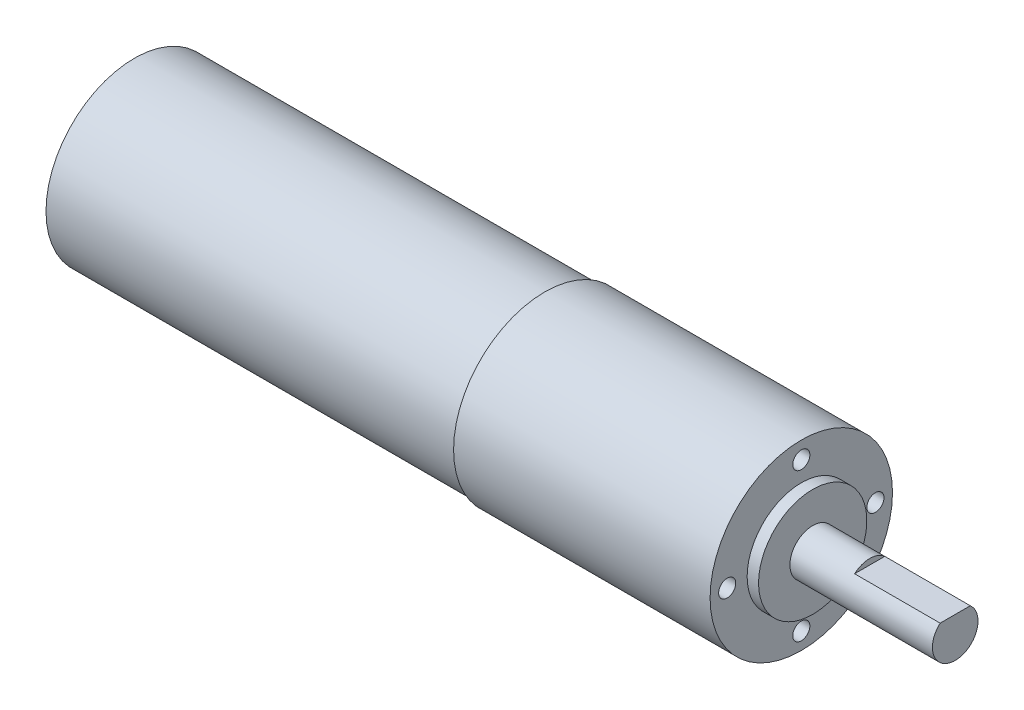
ISO-10303-21;
HEADER;
FILE_DESCRIPTION(('STEP AP214'),'2;1');
FILE_NAME('part.step','',(''),(''),'','','');
FILE_SCHEMA(('AUTOMOTIVE_DESIGN { 1 0 10303 214 1 1 1 1 }'));
ENDSEC;
DATA;
#1=APPLICATION_CONTEXT('core data for automotive mechanical design processes');
#2=APPLICATION_PROTOCOL_DEFINITION('international standard','automotive_design',2000,#1);
#3=PRODUCT_CONTEXT('',#1,'mechanical');
#4=PRODUCT('Part','Part','',(#3));
#5=PRODUCT_RELATED_PRODUCT_CATEGORY('part','',(#4));
#6=PRODUCT_DEFINITION_FORMATION('','',#4);
#7=PRODUCT_DEFINITION_CONTEXT('part definition',#1,'design');
#8=PRODUCT_DEFINITION('design','',#6,#7);
#9=PRODUCT_DEFINITION_SHAPE('','',#8);
#10=(LENGTH_UNIT() NAMED_UNIT(*) SI_UNIT(.MILLI.,.METRE.));
#11=(NAMED_UNIT(*) PLANE_ANGLE_UNIT() SI_UNIT($,.RADIAN.));
#12=(NAMED_UNIT(*) SI_UNIT($,.STERADIAN.) SOLID_ANGLE_UNIT());
#13=UNCERTAINTY_MEASURE_WITH_UNIT(LENGTH_MEASURE(1.E-05),#10,'distance_accuracy_value','');
#14=(GEOMETRIC_REPRESENTATION_CONTEXT(3) GLOBAL_UNCERTAINTY_ASSIGNED_CONTEXT((#13)) GLOBAL_UNIT_ASSIGNED_CONTEXT((#10,
#11,#12)) REPRESENTATION_CONTEXT('',''));
#15=CARTESIAN_POINT('',(0.,0.,0.));
#16=DIRECTION('',(0.,0.,1.));
#17=DIRECTION('',(1.,0.,0.));
#18=AXIS2_PLACEMENT_3D('',#15,#16,#17);
#19=CARTESIAN_POINT('',(0.,0.,0.));
#20=DIRECTION('',(1.,0.,0.));
#21=DIRECTION('',(0.,0.,-1.));
#22=AXIS2_PLACEMENT_3D('',#19,#20,#21);
#23=PLANE('',#22);
#24=CARTESIAN_POINT('',(0.,0.,0.));
#25=DIRECTION('',(-1.,0.,0.));
#26=DIRECTION('',(0.,0.,1.));
#27=AXIS2_PLACEMENT_3D('',#24,#25,#26);
#28=CIRCLE('',#27,15.5);
#29=CARTESIAN_POINT('',(0.,0.,15.5));
#30=VERTEX_POINT('',#29);
#31=EDGE_CURVE('E11',#30,#30,#28,.T.);
#32=ORIENTED_EDGE('',*,*,#31,.T.);
#33=EDGE_LOOP('',(#32));
#34=FACE_BOUND('',#33,.T.);
#35=ADVANCED_FACE('F39',(#34),#23,.F.);
#36=CARTESIAN_POINT('',(0.,0.,0.));
#37=DIRECTION('',(-1.,0.,0.));
#38=DIRECTION('',(0.,0.,1.));
#39=AXIS2_PLACEMENT_3D('',#36,#37,#38);
#40=CYLINDRICAL_SURFACE('',#39,15.5);
#41=ORIENTED_EDGE('',*,*,#31,.F.);
#42=EDGE_LOOP('',(#41));
#43=FACE_BOUND('',#42,.T.);
#44=CARTESIAN_POINT('',(72.,0.,0.));
#45=DIRECTION('',(-1.,0.,0.));
#46=DIRECTION('',(0.,0.,1.));
#47=AXIS2_PLACEMENT_3D('',#44,#45,#46);
#48=CIRCLE('',#47,15.5);
#49=CARTESIAN_POINT('',(72.,0.,15.5));
#50=VERTEX_POINT('',#49);
#51=EDGE_CURVE('E47',#50,#50,#48,.T.);
#52=ORIENTED_EDGE('',*,*,#51,.T.);
#53=EDGE_LOOP('',(#52));
#54=FACE_BOUND('',#53,.T.);
#55=ADVANCED_FACE('F109',(#43,#54),#40,.T.);
#56=CARTESIAN_POINT('',(72.,15.5,0.));
#57=DIRECTION('',(1.,0.,0.));
#58=DIRECTION('',(0.,0.,-1.));
#59=AXIS2_PLACEMENT_3D('',#56,#57,#58);
#60=PLANE('',#59);
#61=ORIENTED_EDGE('',*,*,#51,.F.);
#62=EDGE_LOOP('',(#61));
#63=FACE_BOUND('',#62,.T.);
#64=CARTESIAN_POINT('',(72.,0.,0.));
#65=DIRECTION('',(-1.,0.,0.));
#66=DIRECTION('',(0.,0.,1.));
#67=AXIS2_PLACEMENT_3D('',#64,#65,#66);
#68=CIRCLE('',#67,16.);
#69=CARTESIAN_POINT('',(72.,0.,16.));
#70=VERTEX_POINT('',#69);
#71=EDGE_CURVE('E102',#70,#70,#68,.T.);
#72=ORIENTED_EDGE('',*,*,#71,.T.);
#73=EDGE_LOOP('',(#72));
#74=FACE_BOUND('',#73,.T.);
#75=ADVANCED_FACE('F111',(#63,#74),#60,.F.);
#76=CARTESIAN_POINT('',(0.,0.,0.));
#77=DIRECTION('',(-1.,0.,0.));
#78=DIRECTION('',(0.,0.,1.));
#79=AXIS2_PLACEMENT_3D('',#76,#77,#78);
#80=CYLINDRICAL_SURFACE('',#79,16.);
#81=ORIENTED_EDGE('',*,*,#71,.F.);
#82=EDGE_LOOP('',(#81));
#83=FACE_BOUND('',#82,.T.);
#84=CARTESIAN_POINT('',(117.,0.,0.));
#85=DIRECTION('',(-1.,0.,0.));
#86=DIRECTION('',(0.,0.,1.));
#87=AXIS2_PLACEMENT_3D('',#84,#85,#86);
#88=CIRCLE('',#87,16.);
#89=CARTESIAN_POINT('',(117.,0.,16.));
#90=VERTEX_POINT('',#89);
#91=EDGE_CURVE('E98',#90,#90,#88,.T.);
#92=ORIENTED_EDGE('',*,*,#91,.T.);
#93=EDGE_LOOP('',(#92));
#94=FACE_BOUND('',#93,.T.);
#95=ADVANCED_FACE('F114',(#83,#94),#80,.T.);
#96=CARTESIAN_POINT('',(117.,16.,0.));
#97=DIRECTION('',(-1.,0.,0.));
#98=DIRECTION('',(0.,0.,1.));
#99=AXIS2_PLACEMENT_3D('',#96,#97,#98);
#100=PLANE('',#99);
#101=CARTESIAN_POINT('',(117.,13.,0.));
#102=DIRECTION('',(1.,0.,0.));
#103=DIRECTION('',(0.,0.,-1.));
#104=AXIS2_PLACEMENT_3D('',#101,#102,#103);
#105=CIRCLE('',#104,1.5);
#106=CARTESIAN_POINT('',(117.,13.,-1.5));
#107=VERTEX_POINT('',#106);
#108=EDGE_CURVE('E291',#107,#107,#105,.T.);
#109=ORIENTED_EDGE('',*,*,#108,.F.);
#110=EDGE_LOOP('',(#109));
#111=FACE_BOUND('',#110,.T.);
#112=CARTESIAN_POINT('',(117.,0.,-13.));
#113=DIRECTION('',(1.,0.,0.));
#114=DIRECTION('',(0.,0.,-1.));
#115=AXIS2_PLACEMENT_3D('',#112,#113,#114);
#116=CIRCLE('',#115,1.5);
#117=CARTESIAN_POINT('',(117.,0.,-14.5));
#118=VERTEX_POINT('',#117);
#119=EDGE_CURVE('E301',#118,#118,#116,.T.);
#120=ORIENTED_EDGE('',*,*,#119,.F.);
#121=EDGE_LOOP('',(#120));
#122=FACE_BOUND('',#121,.T.);
#123=CARTESIAN_POINT('',(117.,-13.,0.));
#124=DIRECTION('',(1.,0.,0.));
#125=DIRECTION('',(0.,0.,-1.));
#126=AXIS2_PLACEMENT_3D('',#123,#124,#125);
#127=CIRCLE('',#126,1.5);
#128=CARTESIAN_POINT('',(117.,-13.,-1.5));
#129=VERTEX_POINT('',#128);
#130=EDGE_CURVE('E309',#129,#129,#127,.T.);
#131=ORIENTED_EDGE('',*,*,#130,.F.);
#132=EDGE_LOOP('',(#131));
#133=FACE_BOUND('',#132,.T.);
#134=CARTESIAN_POINT('',(117.,0.,13.));
#135=DIRECTION('',(1.,0.,0.));
#136=DIRECTION('',(0.,0.,-1.));
#137=AXIS2_PLACEMENT_3D('',#134,#135,#136);
#138=CIRCLE('',#137,1.5);
#139=CARTESIAN_POINT('',(117.,0.,11.5));
#140=VERTEX_POINT('',#139);
#141=EDGE_CURVE('E317',#140,#140,#138,.T.);
#142=ORIENTED_EDGE('',*,*,#141,.F.);
#143=EDGE_LOOP('',(#142));
#144=FACE_BOUND('',#143,.T.);
#145=ORIENTED_EDGE('',*,*,#91,.F.);
#146=EDGE_LOOP('',(#145));
#147=FACE_BOUND('',#146,.T.);
#148=CARTESIAN_POINT('',(117.,0.,0.));
#149=DIRECTION('',(-1.,0.,0.));
#150=DIRECTION('',(0.,0.,1.));
#151=AXIS2_PLACEMENT_3D('',#148,#149,#150);
#152=CIRCLE('',#151,9.5);
#153=CARTESIAN_POINT('',(117.,0.,9.5));
#154=VERTEX_POINT('',#153);
#155=EDGE_CURVE('E94',#154,#154,#152,.T.);
#156=ORIENTED_EDGE('',*,*,#155,.T.);
#157=EDGE_LOOP('',(#156));
#158=FACE_BOUND('',#157,.T.);
#159=ADVANCED_FACE('F120',(#111,#122,#133,#144,#147,#158),#100,.F.);
#160=CARTESIAN_POINT('',(0.,0.,0.));
#161=DIRECTION('',(-1.,0.,0.));
#162=DIRECTION('',(0.,0.,1.));
#163=AXIS2_PLACEMENT_3D('',#160,#161,#162);
#164=CYLINDRICAL_SURFACE('',#163,9.5);
#165=ORIENTED_EDGE('',*,*,#155,.F.);
#166=EDGE_LOOP('',(#165));
#167=FACE_BOUND('',#166,.T.);
#168=CARTESIAN_POINT('',(119.,0.,0.));
#169=DIRECTION('',(-1.,0.,0.));
#170=DIRECTION('',(0.,0.,1.));
#171=AXIS2_PLACEMENT_3D('',#168,#169,#170);
#172=CIRCLE('',#171,9.5);
#173=CARTESIAN_POINT('',(119.,0.,9.5));
#174=VERTEX_POINT('',#173);
#175=EDGE_CURVE('E87',#174,#174,#172,.T.);
#176=ORIENTED_EDGE('',*,*,#175,.T.);
#177=EDGE_LOOP('',(#176));
#178=FACE_BOUND('',#177,.T.);
#179=ADVANCED_FACE('F126',(#167,#178),#164,.T.);
#180=CARTESIAN_POINT('',(119.,9.5,0.));
#181=DIRECTION('',(-1.,0.,0.));
#182=DIRECTION('',(0.,0.,1.));
#183=AXIS2_PLACEMENT_3D('',#180,#181,#182);
#184=PLANE('',#183);
#185=ORIENTED_EDGE('',*,*,#175,.F.);
#186=EDGE_LOOP('',(#185));
#187=FACE_BOUND('',#186,.T.);
#188=CARTESIAN_POINT('',(119.,0.,0.));
#189=DIRECTION('',(-1.,0.,0.));
#190=DIRECTION('',(0.,0.,1.));
#191=AXIS2_PLACEMENT_3D('',#188,#189,#190);
#192=CIRCLE('',#191,4.);
#193=CARTESIAN_POINT('',(119.,0.,4.));
#194=VERTEX_POINT('',#193);
#195=EDGE_CURVE('E83',#194,#194,#192,.T.);
#196=ORIENTED_EDGE('',*,*,#195,.T.);
#197=EDGE_LOOP('',(#196));
#198=FACE_BOUND('',#197,.T.);
#199=ADVANCED_FACE('F133',(#187,#198),#184,.F.);
#200=CARTESIAN_POINT('',(0.,0.,0.));
#201=DIRECTION('',(-1.,0.,0.));
#202=DIRECTION('',(0.,0.,1.));
#203=AXIS2_PLACEMENT_3D('',#200,#201,#202);
#204=CYLINDRICAL_SURFACE('',#203,4.);
#205=CARTESIAN_POINT('',(144.,0.,0.));
#206=DIRECTION('',(-1.,0.,0.));
#207=DIRECTION('',(0.,0.,1.));
#208=AXIS2_PLACEMENT_3D('',#205,#206,#207);
#209=CIRCLE('',#208,4.);
#210=CARTESIAN_POINT('',(144.,3.,-2.64575131106459));
#211=VERTEX_POINT('',#210);
#212=CARTESIAN_POINT('',(144.,3.,2.64575131106459));
#213=VERTEX_POINT('',#212);
#214=EDGE_CURVE('E78',#211,#213,#209,.T.);
#215=ORIENTED_EDGE('',*,*,#214,.T.);
#216=DIRECTION('',(1.,0.,0.));
#217=VECTOR('',#216,1.);
#218=CARTESIAN_POINT('',(129.,3.,2.64575131106459));
#219=LINE('',#218,#217);
#220=CARTESIAN_POINT('',(129.,3.,2.64575131106459));
#221=VERTEX_POINT('',#220);
#222=EDGE_CURVE('E54',#221,#213,#219,.T.);
#223=ORIENTED_EDGE('',*,*,#222,.F.);
#224=CARTESIAN_POINT('',(129.,0.,0.));
#225=DIRECTION('',(1.,0.,0.));
#226=DIRECTION('',(0.,0.,-1.));
#227=AXIS2_PLACEMENT_3D('',#224,#225,#226);
#228=CIRCLE('',#227,4.);
#229=CARTESIAN_POINT('',(129.,3.,-2.64575131106459));
#230=VERTEX_POINT('',#229);
#231=EDGE_CURVE('E71',#230,#221,#228,.T.);
#232=ORIENTED_EDGE('',*,*,#231,.F.);
#233=DIRECTION('',(1.,0.,0.));
#234=VECTOR('',#233,1.);
#235=CARTESIAN_POINT('',(129.,3.,-2.64575131106459));
#236=LINE('',#235,#234);
#237=EDGE_CURVE('E60',#230,#211,#236,.T.);
#238=ORIENTED_EDGE('',*,*,#237,.T.);
#239=EDGE_LOOP('',(#215,#223,#232,#238));
#240=FACE_BOUND('',#239,.T.);
#241=ORIENTED_EDGE('',*,*,#195,.F.);
#242=EDGE_LOOP('',(#241));
#243=FACE_BOUND('',#242,.T.);
#244=ADVANCED_FACE('F76',(#240,#243),#204,.T.);
#245=CARTESIAN_POINT('',(144.,4.,0.));
#246=DIRECTION('',(-1.,0.,0.));
#247=DIRECTION('',(0.,0.,1.));
#248=AXIS2_PLACEMENT_3D('',#245,#246,#247);
#249=PLANE('',#248);
#250=ORIENTED_EDGE('',*,*,#214,.F.);
#251=DIRECTION('',(0.,0.,-1.));
#252=VECTOR('',#251,1.);
#253=CARTESIAN_POINT('',(144.,3.,2.64575131106459));
#254=LINE('',#253,#252);
#255=EDGE_CURVE('E65',#213,#211,#254,.T.);
#256=ORIENTED_EDGE('',*,*,#255,.F.);
#257=EDGE_LOOP('',(#250,#256));
#258=FACE_BOUND('',#257,.T.);
#259=ADVANCED_FACE('F81',(#258),#249,.F.);
#260=CARTESIAN_POINT('',(129.,3.,2.64575131106459));
#261=DIRECTION('',(0.,-1.,0.));
#262=DIRECTION('',(0.,0.,-1.));
#263=AXIS2_PLACEMENT_3D('',#260,#261,#262);
#264=PLANE('',#263);
#265=ORIENTED_EDGE('',*,*,#255,.T.);
#266=ORIENTED_EDGE('',*,*,#237,.F.);
#267=DIRECTION('',(0.,0.,-1.));
#268=VECTOR('',#267,1.);
#269=CARTESIAN_POINT('',(129.,3.,2.64575131106459));
#270=LINE('',#269,#268);
#271=EDGE_CURVE('E323',#221,#230,#270,.T.);
#272=ORIENTED_EDGE('',*,*,#271,.F.);
#273=ORIENTED_EDGE('',*,*,#222,.T.);
#274=EDGE_LOOP('',(#265,#266,#272,#273));
#275=FACE_BOUND('',#274,.T.);
#276=ADVANCED_FACE('F66',(#275),#264,.F.);
#277=CARTESIAN_POINT('',(129.,0.,0.));
#278=DIRECTION('',(1.,0.,0.));
#279=DIRECTION('',(0.,0.,-1.));
#280=AXIS2_PLACEMENT_3D('',#277,#278,#279);
#281=PLANE('',#280);
#282=ORIENTED_EDGE('',*,*,#231,.T.);
#283=ORIENTED_EDGE('',*,*,#271,.T.);
#284=EDGE_LOOP('',(#282,#283));
#285=FACE_BOUND('',#284,.T.);
#286=ADVANCED_FACE('F196',(#285),#281,.T.);
#287=CARTESIAN_POINT('',(112.,0.,13.));
#288=DIRECTION('',(1.,0.,0.));
#289=DIRECTION('',(0.,0.,-1.));
#290=AXIS2_PLACEMENT_3D('',#287,#288,#289);
#291=CYLINDRICAL_SURFACE('',#290,1.5);
#292=CARTESIAN_POINT('',(112.,0.,13.));
#293=DIRECTION('',(1.,0.,0.));
#294=DIRECTION('',(0.,0.,-1.));
#295=AXIS2_PLACEMENT_3D('',#292,#293,#294);
#296=CIRCLE('',#295,1.5);
#297=CARTESIAN_POINT('',(112.,0.,11.5));
#298=VERTEX_POINT('',#297);
#299=EDGE_CURVE('E313',#298,#298,#296,.T.);
#300=ORIENTED_EDGE('',*,*,#299,.F.);
#301=EDGE_LOOP('',(#300));
#302=FACE_BOUND('',#301,.T.);
#303=ORIENTED_EDGE('',*,*,#141,.T.);
#304=EDGE_LOOP('',(#303));
#305=FACE_BOUND('',#304,.T.);
#306=ADVANCED_FACE('F204',(#302,#305),#291,.F.);
#307=CARTESIAN_POINT('',(112.,0.,13.));
#308=DIRECTION('',(1.,0.,0.));
#309=DIRECTION('',(0.,0.,-1.));
#310=AXIS2_PLACEMENT_3D('',#307,#308,#309);
#311=PLANE('',#310);
#312=ORIENTED_EDGE('',*,*,#299,.T.);
#313=EDGE_LOOP('',(#312));
#314=FACE_BOUND('',#313,.T.);
#315=ADVANCED_FACE('F214',(#314),#311,.T.);
#316=CARTESIAN_POINT('',(112.,-13.,0.));
#317=DIRECTION('',(1.,0.,0.));
#318=DIRECTION('',(0.,0.,-1.));
#319=AXIS2_PLACEMENT_3D('',#316,#317,#318);
#320=CYLINDRICAL_SURFACE('',#319,1.5);
#321=CARTESIAN_POINT('',(112.,-13.,0.));
#322=DIRECTION('',(1.,0.,0.));
#323=DIRECTION('',(0.,0.,-1.));
#324=AXIS2_PLACEMENT_3D('',#321,#322,#323);
#325=CIRCLE('',#324,1.5);
#326=CARTESIAN_POINT('',(112.,-13.,-1.5));
#327=VERTEX_POINT('',#326);
#328=EDGE_CURVE('E305',#327,#327,#325,.T.);
#329=ORIENTED_EDGE('',*,*,#328,.F.);
#330=EDGE_LOOP('',(#329));
#331=FACE_BOUND('',#330,.T.);
#332=ORIENTED_EDGE('',*,*,#130,.T.);
#333=EDGE_LOOP('',(#332));
#334=FACE_BOUND('',#333,.T.);
#335=ADVANCED_FACE('F221',(#331,#334),#320,.F.);
#336=CARTESIAN_POINT('',(112.,-13.,0.));
#337=DIRECTION('',(1.,0.,0.));
#338=DIRECTION('',(0.,0.,-1.));
#339=AXIS2_PLACEMENT_3D('',#336,#337,#338);
#340=PLANE('',#339);
#341=ORIENTED_EDGE('',*,*,#328,.T.);
#342=EDGE_LOOP('',(#341));
#343=FACE_BOUND('',#342,.T.);
#344=ADVANCED_FACE('F229',(#343),#340,.T.);
#345=CARTESIAN_POINT('',(112.,0.,-13.));
#346=DIRECTION('',(1.,0.,0.));
#347=DIRECTION('',(0.,0.,-1.));
#348=AXIS2_PLACEMENT_3D('',#345,#346,#347);
#349=CYLINDRICAL_SURFACE('',#348,1.5);
#350=CARTESIAN_POINT('',(112.,0.,-13.));
#351=DIRECTION('',(1.,0.,0.));
#352=DIRECTION('',(0.,0.,-1.));
#353=AXIS2_PLACEMENT_3D('',#350,#351,#352);
#354=CIRCLE('',#353,1.5);
#355=CARTESIAN_POINT('',(112.,0.,-14.5));
#356=VERTEX_POINT('',#355);
#357=EDGE_CURVE('E295',#356,#356,#354,.T.);
#358=ORIENTED_EDGE('',*,*,#357,.F.);
#359=EDGE_LOOP('',(#358));
#360=FACE_BOUND('',#359,.T.);
#361=ORIENTED_EDGE('',*,*,#119,.T.);
#362=EDGE_LOOP('',(#361));
#363=FACE_BOUND('',#362,.T.);
#364=ADVANCED_FACE('F237',(#360,#363),#349,.F.);
#365=CARTESIAN_POINT('',(112.,0.,-13.));
#366=DIRECTION('',(1.,0.,0.));
#367=DIRECTION('',(0.,0.,-1.));
#368=AXIS2_PLACEMENT_3D('',#365,#366,#367);
#369=PLANE('',#368);
#370=ORIENTED_EDGE('',*,*,#357,.T.);
#371=EDGE_LOOP('',(#370));
#372=FACE_BOUND('',#371,.T.);
#373=ADVANCED_FACE('F245',(#372),#369,.T.);
#374=CARTESIAN_POINT('',(112.,13.,0.));
#375=DIRECTION('',(1.,0.,0.));
#376=DIRECTION('',(0.,0.,-1.));
#377=AXIS2_PLACEMENT_3D('',#374,#375,#376);
#378=CYLINDRICAL_SURFACE('',#377,1.5);
#379=CARTESIAN_POINT('',(112.,13.,0.));
#380=DIRECTION('',(1.,0.,0.));
#381=DIRECTION('',(0.,0.,-1.));
#382=AXIS2_PLACEMENT_3D('',#379,#380,#381);
#383=CIRCLE('',#382,1.5);
#384=CARTESIAN_POINT('',(112.,13.,-1.5));
#385=VERTEX_POINT('',#384);
#386=EDGE_CURVE('E72',#385,#385,#383,.T.);
#387=ORIENTED_EDGE('',*,*,#386,.F.);
#388=EDGE_LOOP('',(#387));
#389=FACE_BOUND('',#388,.T.);
#390=ORIENTED_EDGE('',*,*,#108,.T.);
#391=EDGE_LOOP('',(#390));
#392=FACE_BOUND('',#391,.T.);
#393=ADVANCED_FACE('F253',(#389,#392),#378,.F.);
#394=CARTESIAN_POINT('',(112.,13.,0.));
#395=DIRECTION('',(1.,0.,0.));
#396=DIRECTION('',(0.,0.,-1.));
#397=AXIS2_PLACEMENT_3D('',#394,#395,#396);
#398=PLANE('',#397);
#399=ORIENTED_EDGE('',*,*,#386,.T.);
#400=EDGE_LOOP('',(#399));
#401=FACE_BOUND('',#400,.T.);
#402=ADVANCED_FACE('F261',(#401),#398,.T.);
#403=CLOSED_SHELL('',(#35,#55,#75,#95,#159,#179,#199,#244,#259,#276,#286,#306,#315,#335,#344,
#364,#373,#393,#402));
#404=MANIFOLD_SOLID_BREP('B2',#403);
#405=ADVANCED_BREP_SHAPE_REPRESENTATION('',(#18,#404),#14);
#406=SHAPE_DEFINITION_REPRESENTATION(#9,#405);
ENDSEC;
END-ISO-10303-21;
